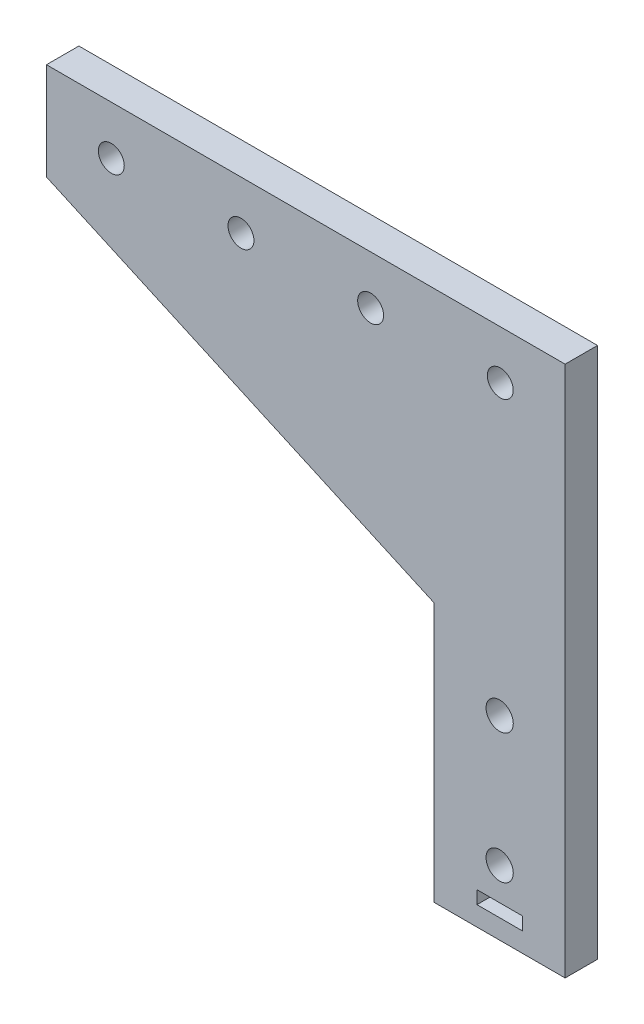
ISO-10303-21;
HEADER;
FILE_DESCRIPTION(('STEP AP214'),'2;1');
FILE_NAME('part.step','',(''),(''),'','','');
FILE_SCHEMA(('AUTOMOTIVE_DESIGN { 1 0 10303 214 1 1 1 1 }'));
ENDSEC;
DATA;
#1=APPLICATION_CONTEXT('core data for automotive mechanical design processes');
#2=APPLICATION_PROTOCOL_DEFINITION('international standard','automotive_design',2000,#1);
#3=PRODUCT_CONTEXT('',#1,'mechanical');
#4=PRODUCT('Part','Part','',(#3));
#5=PRODUCT_RELATED_PRODUCT_CATEGORY('part','',(#4));
#6=PRODUCT_DEFINITION_FORMATION('','',#4);
#7=PRODUCT_DEFINITION_CONTEXT('part definition',#1,'design');
#8=PRODUCT_DEFINITION('design','',#6,#7);
#9=PRODUCT_DEFINITION_SHAPE('','',#8);
#10=(LENGTH_UNIT() NAMED_UNIT(*) SI_UNIT(.MILLI.,.METRE.));
#11=(NAMED_UNIT(*) PLANE_ANGLE_UNIT() SI_UNIT($,.RADIAN.));
#12=(NAMED_UNIT(*) SI_UNIT($,.STERADIAN.) SOLID_ANGLE_UNIT());
#13=UNCERTAINTY_MEASURE_WITH_UNIT(LENGTH_MEASURE(1.E-05),#10,'distance_accuracy_value','');
#14=(GEOMETRIC_REPRESENTATION_CONTEXT(3) GLOBAL_UNCERTAINTY_ASSIGNED_CONTEXT((#13)) GLOBAL_UNIT_ASSIGNED_CONTEXT((#10,
#11,#12)) REPRESENTATION_CONTEXT('',''));
#15=CARTESIAN_POINT('',(0.,0.,0.));
#16=DIRECTION('',(0.,0.,1.));
#17=DIRECTION('',(1.,0.,0.));
#18=AXIS2_PLACEMENT_3D('',#15,#16,#17);
#19=CARTESIAN_POINT('',(0.,0.,5.));
#20=DIRECTION('',(0.,0.,-1.));
#21=DIRECTION('',(-1.,0.,0.));
#22=AXIS2_PLACEMENT_3D('',#19,#20,#21);
#23=PLANE('',#22);
#24=CARTESIAN_POINT('',(-70.,74.5,5.));
#25=DIRECTION('',(0.,0.,1.));
#26=DIRECTION('',(1.,0.,0.));
#27=AXIS2_PLACEMENT_3D('',#24,#25,#26);
#28=CIRCLE('',#27,2.);
#29=CARTESIAN_POINT('',(-68.,74.5,5.));
#30=VERTEX_POINT('',#29);
#31=EDGE_CURVE('E168',#30,#30,#28,.T.);
#32=ORIENTED_EDGE('',*,*,#31,.F.);
#33=EDGE_LOOP('',(#32));
#34=FACE_BOUND('',#33,.T.);
#35=CARTESIAN_POINT('',(-10.0957912661567,30.,5.));
#36=DIRECTION('',(0.,0.,1.));
#37=DIRECTION('',(1.,0.,0.));
#38=AXIS2_PLACEMENT_3D('',#35,#36,#37);
#39=CIRCLE('',#38,2.1);
#40=CARTESIAN_POINT('',(-7.99579126615672,30.,5.));
#41=VERTEX_POINT('',#40);
#42=EDGE_CURVE('E176',#41,#41,#39,.T.);
#43=ORIENTED_EDGE('',*,*,#42,.F.);
#44=EDGE_LOOP('',(#43));
#45=FACE_BOUND('',#44,.T.);
#46=CARTESIAN_POINT('',(-10.0957912661567,10.,5.));
#47=DIRECTION('',(0.,0.,1.));
#48=DIRECTION('',(1.,0.,0.));
#49=AXIS2_PLACEMENT_3D('',#46,#47,#48);
#50=CIRCLE('',#49,2.1);
#51=CARTESIAN_POINT('',(-7.99579126615672,10.,5.));
#52=VERTEX_POINT('',#51);
#53=EDGE_CURVE('E184',#52,#52,#50,.T.);
#54=ORIENTED_EDGE('',*,*,#53,.F.);
#55=EDGE_LOOP('',(#54));
#56=FACE_BOUND('',#55,.T.);
#57=DIRECTION('',(1.,0.,0.));
#58=VECTOR('',#57,1.);
#59=CARTESIAN_POINT('',(0.,0.,5.));
#60=LINE('',#59,#58);
#61=CARTESIAN_POINT('',(-20.1915825323134,0.,5.));
#62=VERTEX_POINT('',#61);
#63=CARTESIAN_POINT('',(0.,0.,5.));
#64=VERTEX_POINT('',#63);
#65=EDGE_CURVE('E192',#62,#64,#60,.T.);
#66=ORIENTED_EDGE('',*,*,#65,.T.);
#67=DIRECTION('',(0.,1.,0.));
#68=VECTOR('',#67,1.);
#69=CARTESIAN_POINT('',(0.,0.,5.));
#70=LINE('',#69,#68);
#71=CARTESIAN_POINT('',(0.,82.,5.));
#72=VERTEX_POINT('',#71);
#73=EDGE_CURVE('E196',#64,#72,#70,.T.);
#74=ORIENTED_EDGE('',*,*,#73,.T.);
#75=DIRECTION('',(-1.,0.,0.));
#76=VECTOR('',#75,1.);
#77=CARTESIAN_POINT('',(-80.,82.,5.));
#78=LINE('',#77,#76);
#79=CARTESIAN_POINT('',(-80.,82.,5.));
#80=VERTEX_POINT('',#79);
#81=EDGE_CURVE('E200',#72,#80,#78,.T.);
#82=ORIENTED_EDGE('',*,*,#81,.T.);
#83=DIRECTION('',(0.,-1.,0.));
#84=VECTOR('',#83,1.);
#85=CARTESIAN_POINT('',(-80.,82.,5.));
#86=LINE('',#85,#84);
#87=CARTESIAN_POINT('',(-80.,67.,5.));
#88=VERTEX_POINT('',#87);
#89=EDGE_CURVE('E203',#80,#88,#86,.T.);
#90=ORIENTED_EDGE('',*,*,#89,.T.);
#91=DIRECTION('',(0.911429200195557,-0.411456939461333,0.));
#92=VECTOR('',#91,1.);
#93=CARTESIAN_POINT('',(-80.,67.,5.));
#94=LINE('',#93,#92);
#95=CARTESIAN_POINT('',(-20.1915825323134,40.,5.));
#96=VERTEX_POINT('',#95);
#97=EDGE_CURVE('E206',#88,#96,#94,.T.);
#98=ORIENTED_EDGE('',*,*,#97,.T.);
#99=DIRECTION('',(0.,-1.,0.));
#100=VECTOR('',#99,1.);
#101=CARTESIAN_POINT('',(-20.1915825323134,0.,5.));
#102=LINE('',#101,#100);
#103=EDGE_CURVE('E209',#96,#62,#102,.T.);
#104=ORIENTED_EDGE('',*,*,#103,.T.);
#105=EDGE_LOOP('',(#66,#74,#82,#90,#98,#104));
#106=FACE_BOUND('',#105,.T.);
#107=DIRECTION('',(0.,-1.,0.));
#108=VECTOR('',#107,1.);
#109=CARTESIAN_POINT('',(-13.5957912661567,5.,5.));
#110=LINE('',#109,#108);
#111=CARTESIAN_POINT('',(-13.5957912661567,5.,5.));
#112=VERTEX_POINT('',#111);
#113=CARTESIAN_POINT('',(-13.5957912661567,3.,5.));
#114=VERTEX_POINT('',#113);
#115=EDGE_CURVE('E117',#112,#114,#110,.T.);
#116=ORIENTED_EDGE('',*,*,#115,.F.);
#117=DIRECTION('',(-1.,0.,0.));
#118=VECTOR('',#117,1.);
#119=CARTESIAN_POINT('',(-13.5957912661567,5.,5.));
#120=LINE('',#119,#118);
#121=CARTESIAN_POINT('',(-6.59579126615672,5.,5.));
#122=VERTEX_POINT('',#121);
#123=EDGE_CURVE('E144',#122,#112,#120,.T.);
#124=ORIENTED_EDGE('',*,*,#123,.F.);
#125=DIRECTION('',(0.,1.,0.));
#126=VECTOR('',#125,1.);
#127=CARTESIAN_POINT('',(-6.59579126615672,5.,5.));
#128=LINE('',#127,#126);
#129=CARTESIAN_POINT('',(-6.59579126615672,3.,5.));
#130=VERTEX_POINT('',#129);
#131=EDGE_CURVE('E140',#130,#122,#128,.T.);
#132=ORIENTED_EDGE('',*,*,#131,.F.);
#133=DIRECTION('',(1.,0.,0.));
#134=VECTOR('',#133,1.);
#135=CARTESIAN_POINT('',(-13.5957912661567,3.,5.));
#136=LINE('',#135,#134);
#137=EDGE_CURVE('E126',#114,#130,#136,.T.);
#138=ORIENTED_EDGE('',*,*,#137,.F.);
#139=EDGE_LOOP('',(#116,#124,#132,#138));
#140=FACE_BOUND('',#139,.T.);
#141=CARTESIAN_POINT('',(-50.,74.5,5.));
#142=DIRECTION('',(0.,0.,1.));
#143=DIRECTION('',(1.,0.,0.));
#144=AXIS2_PLACEMENT_3D('',#141,#142,#143);
#145=CIRCLE('',#144,2.);
#146=CARTESIAN_POINT('',(-48.,74.5,5.));
#147=VERTEX_POINT('',#146);
#148=EDGE_CURVE('E152',#147,#147,#145,.T.);
#149=ORIENTED_EDGE('',*,*,#148,.F.);
#150=EDGE_LOOP('',(#149));
#151=FACE_BOUND('',#150,.T.);
#152=CARTESIAN_POINT('',(-30.,74.5,5.));
#153=DIRECTION('',(0.,0.,1.));
#154=DIRECTION('',(1.,0.,0.));
#155=AXIS2_PLACEMENT_3D('',#152,#153,#154);
#156=CIRCLE('',#155,2.);
#157=CARTESIAN_POINT('',(-28.,74.5,5.));
#158=VERTEX_POINT('',#157);
#159=EDGE_CURVE('E344',#158,#158,#156,.T.);
#160=ORIENTED_EDGE('',*,*,#159,.F.);
#161=EDGE_LOOP('',(#160));
#162=FACE_BOUND('',#161,.T.);
#163=CARTESIAN_POINT('',(-10.,74.5,5.));
#164=DIRECTION('',(0.,0.,1.));
#165=DIRECTION('',(1.,0.,0.));
#166=AXIS2_PLACEMENT_3D('',#163,#164,#165);
#167=CIRCLE('',#166,2.);
#168=CARTESIAN_POINT('',(-8.00000000000001,74.5,5.));
#169=VERTEX_POINT('',#168);
#170=EDGE_CURVE('E333',#169,#169,#167,.T.);
#171=ORIENTED_EDGE('',*,*,#170,.F.);
#172=EDGE_LOOP('',(#171));
#173=FACE_BOUND('',#172,.T.);
#174=ADVANCED_FACE('F39',(#34,#45,#56,#106,#140,#151,#162,#173),#23,.F.);
#175=CARTESIAN_POINT('',(0.,0.,0.));
#176=DIRECTION('',(0.,0.,-1.));
#177=DIRECTION('',(-1.,0.,0.));
#178=AXIS2_PLACEMENT_3D('',#175,#176,#177);
#179=PLANE('',#178);
#180=CARTESIAN_POINT('',(-30.,74.5,0.));
#181=DIRECTION('',(0.,0.,1.));
#182=DIRECTION('',(1.,0.,0.));
#183=AXIS2_PLACEMENT_3D('',#180,#181,#182);
#184=CIRCLE('',#183,2.);
#185=CARTESIAN_POINT('',(-28.,74.5,0.));
#186=VERTEX_POINT('',#185);
#187=EDGE_CURVE('E341',#186,#186,#184,.T.);
#188=ORIENTED_EDGE('',*,*,#187,.T.);
#189=EDGE_LOOP('',(#188));
#190=FACE_BOUND('',#189,.T.);
#191=DIRECTION('',(-1.,0.,0.));
#192=VECTOR('',#191,1.);
#193=CARTESIAN_POINT('',(-13.5957912661567,5.,0.));
#194=LINE('',#193,#192);
#195=CARTESIAN_POINT('',(-6.59579126615672,5.,0.));
#196=VERTEX_POINT('',#195);
#197=CARTESIAN_POINT('',(-13.5957912661567,5.,0.));
#198=VERTEX_POINT('',#197);
#199=EDGE_CURVE('E127',#196,#198,#194,.T.);
#200=ORIENTED_EDGE('',*,*,#199,.T.);
#201=DIRECTION('',(0.,-1.,0.));
#202=VECTOR('',#201,1.);
#203=CARTESIAN_POINT('',(-13.5957912661567,5.,0.));
#204=LINE('',#203,#202);
#205=CARTESIAN_POINT('',(-13.5957912661567,3.,0.));
#206=VERTEX_POINT('',#205);
#207=EDGE_CURVE('E63',#198,#206,#204,.T.);
#208=ORIENTED_EDGE('',*,*,#207,.T.);
#209=DIRECTION('',(1.,0.,0.));
#210=VECTOR('',#209,1.);
#211=CARTESIAN_POINT('',(-13.5957912661567,3.,0.));
#212=LINE('',#211,#210);
#213=CARTESIAN_POINT('',(-6.59579126615672,3.,0.));
#214=VERTEX_POINT('',#213);
#215=EDGE_CURVE('E133',#206,#214,#212,.T.);
#216=ORIENTED_EDGE('',*,*,#215,.T.);
#217=DIRECTION('',(0.,1.,0.));
#218=VECTOR('',#217,1.);
#219=CARTESIAN_POINT('',(-6.59579126615672,5.,0.));
#220=LINE('',#219,#218);
#221=EDGE_CURVE('E155',#214,#196,#220,.T.);
#222=ORIENTED_EDGE('',*,*,#221,.T.);
#223=EDGE_LOOP('',(#200,#208,#216,#222));
#224=FACE_BOUND('',#223,.T.);
#225=CARTESIAN_POINT('',(-70.,74.5,0.));
#226=DIRECTION('',(0.,0.,1.));
#227=DIRECTION('',(1.,0.,0.));
#228=AXIS2_PLACEMENT_3D('',#225,#226,#227);
#229=CIRCLE('',#228,2.);
#230=CARTESIAN_POINT('',(-68.,74.5,0.));
#231=VERTEX_POINT('',#230);
#232=EDGE_CURVE('E135',#231,#231,#229,.T.);
#233=ORIENTED_EDGE('',*,*,#232,.T.);
#234=EDGE_LOOP('',(#233));
#235=FACE_BOUND('',#234,.T.);
#236=CARTESIAN_POINT('',(-10.0957912661567,10.,0.));
#237=DIRECTION('',(0.,0.,1.));
#238=DIRECTION('',(1.,0.,0.));
#239=AXIS2_PLACEMENT_3D('',#236,#237,#238);
#240=CIRCLE('',#239,2.1);
#241=CARTESIAN_POINT('',(-7.99579126615672,10.,0.));
#242=VERTEX_POINT('',#241);
#243=EDGE_CURVE('E180',#242,#242,#240,.T.);
#244=ORIENTED_EDGE('',*,*,#243,.T.);
#245=EDGE_LOOP('',(#244));
#246=FACE_BOUND('',#245,.T.);
#247=DIRECTION('',(1.,0.,0.));
#248=VECTOR('',#247,1.);
#249=CARTESIAN_POINT('',(0.,0.,0.));
#250=LINE('',#249,#248);
#251=CARTESIAN_POINT('',(-20.1915825323134,0.,0.));
#252=VERTEX_POINT('',#251);
#253=CARTESIAN_POINT('',(0.,0.,0.));
#254=VERTEX_POINT('',#253);
#255=EDGE_CURVE('E188',#252,#254,#250,.T.);
#256=ORIENTED_EDGE('',*,*,#255,.F.);
#257=DIRECTION('',(0.,-1.,0.));
#258=VECTOR('',#257,1.);
#259=CARTESIAN_POINT('',(-20.1915825323134,0.,0.));
#260=LINE('',#259,#258);
#261=CARTESIAN_POINT('',(-20.1915825323134,40.,0.));
#262=VERTEX_POINT('',#261);
#263=EDGE_CURVE('E197',#262,#252,#260,.T.);
#264=ORIENTED_EDGE('',*,*,#263,.F.);
#265=DIRECTION('',(0.911429200195557,-0.411456939461333,0.));
#266=VECTOR('',#265,1.);
#267=CARTESIAN_POINT('',(-80.,67.,0.));
#268=LINE('',#267,#266);
#269=CARTESIAN_POINT('',(-80.,67.,0.));
#270=VERTEX_POINT('',#269);
#271=EDGE_CURVE('E225',#270,#262,#268,.T.);
#272=ORIENTED_EDGE('',*,*,#271,.F.);
#273=DIRECTION('',(0.,-1.,0.));
#274=VECTOR('',#273,1.);
#275=CARTESIAN_POINT('',(-80.,82.,0.));
#276=LINE('',#275,#274);
#277=CARTESIAN_POINT('',(-80.,82.,0.));
#278=VERTEX_POINT('',#277);
#279=EDGE_CURVE('E222',#278,#270,#276,.T.);
#280=ORIENTED_EDGE('',*,*,#279,.F.);
#281=DIRECTION('',(-1.,0.,0.));
#282=VECTOR('',#281,1.);
#283=CARTESIAN_POINT('',(-80.,82.,0.));
#284=LINE('',#283,#282);
#285=CARTESIAN_POINT('',(0.,82.,0.));
#286=VERTEX_POINT('',#285);
#287=EDGE_CURVE('E219',#286,#278,#284,.T.);
#288=ORIENTED_EDGE('',*,*,#287,.F.);
#289=DIRECTION('',(0.,1.,0.));
#290=VECTOR('',#289,1.);
#291=CARTESIAN_POINT('',(0.,0.,0.));
#292=LINE('',#291,#290);
#293=EDGE_CURVE('E216',#254,#286,#292,.T.);
#294=ORIENTED_EDGE('',*,*,#293,.F.);
#295=EDGE_LOOP('',(#256,#264,#272,#280,#288,#294));
#296=FACE_BOUND('',#295,.T.);
#297=CARTESIAN_POINT('',(-10.0957912661567,30.,0.));
#298=DIRECTION('',(0.,0.,1.));
#299=DIRECTION('',(1.,0.,0.));
#300=AXIS2_PLACEMENT_3D('',#297,#298,#299);
#301=CIRCLE('',#300,2.1);
#302=CARTESIAN_POINT('',(-7.99579126615672,30.,0.));
#303=VERTEX_POINT('',#302);
#304=EDGE_CURVE('E172',#303,#303,#301,.T.);
#305=ORIENTED_EDGE('',*,*,#304,.T.);
#306=EDGE_LOOP('',(#305));
#307=FACE_BOUND('',#306,.T.);
#308=CARTESIAN_POINT('',(-50.,74.5,0.));
#309=DIRECTION('',(0.,0.,1.));
#310=DIRECTION('',(1.,0.,0.));
#311=AXIS2_PLACEMENT_3D('',#308,#309,#310);
#312=CIRCLE('',#311,2.);
#313=CARTESIAN_POINT('',(-48.,74.5,0.));
#314=VERTEX_POINT('',#313);
#315=EDGE_CURVE('E348',#314,#314,#312,.T.);
#316=ORIENTED_EDGE('',*,*,#315,.T.);
#317=EDGE_LOOP('',(#316));
#318=FACE_BOUND('',#317,.T.);
#319=CARTESIAN_POINT('',(-10.,74.5,0.));
#320=DIRECTION('',(0.,0.,1.));
#321=DIRECTION('',(1.,0.,0.));
#322=AXIS2_PLACEMENT_3D('',#319,#320,#321);
#323=CIRCLE('',#322,2.);
#324=CARTESIAN_POINT('',(-8.00000000000001,74.5,0.));
#325=VERTEX_POINT('',#324);
#326=EDGE_CURVE('E336',#325,#325,#323,.T.);
#327=ORIENTED_EDGE('',*,*,#326,.T.);
#328=EDGE_LOOP('',(#327));
#329=FACE_BOUND('',#328,.T.);
#330=ADVANCED_FACE('F256',(#190,#224,#235,#246,#296,#307,#318,#329),#179,.T.);
#331=CARTESIAN_POINT('',(0.,0.,5.));
#332=DIRECTION('',(0.,1.,0.));
#333=DIRECTION('',(0.,0.,1.));
#334=AXIS2_PLACEMENT_3D('',#331,#332,#333);
#335=PLANE('',#334);
#336=ORIENTED_EDGE('',*,*,#255,.T.);
#337=DIRECTION('',(0.,0.,-1.));
#338=VECTOR('',#337,1.);
#339=CARTESIAN_POINT('',(0.,0.,5.));
#340=LINE('',#339,#338);
#341=EDGE_CURVE('E11',#64,#254,#340,.T.);
#342=ORIENTED_EDGE('',*,*,#341,.F.);
#343=ORIENTED_EDGE('',*,*,#65,.F.);
#344=DIRECTION('',(0.,0.,-1.));
#345=VECTOR('',#344,1.);
#346=CARTESIAN_POINT('',(-20.1915825323134,0.,5.));
#347=LINE('',#346,#345);
#348=EDGE_CURVE('E212',#62,#252,#347,.T.);
#349=ORIENTED_EDGE('',*,*,#348,.T.);
#350=EDGE_LOOP('',(#336,#342,#343,#349));
#351=FACE_BOUND('',#350,.T.);
#352=ADVANCED_FACE('F41',(#351),#335,.F.);
#353=CARTESIAN_POINT('',(0.,0.,5.));
#354=DIRECTION('',(-1.,0.,0.));
#355=DIRECTION('',(0.,0.,1.));
#356=AXIS2_PLACEMENT_3D('',#353,#354,#355);
#357=PLANE('',#356);
#358=ORIENTED_EDGE('',*,*,#293,.T.);
#359=DIRECTION('',(0.,0.,-1.));
#360=VECTOR('',#359,1.);
#361=CARTESIAN_POINT('',(0.,82.,5.));
#362=LINE('',#361,#360);
#363=EDGE_CURVE('E48',#72,#286,#362,.T.);
#364=ORIENTED_EDGE('',*,*,#363,.F.);
#365=ORIENTED_EDGE('',*,*,#73,.F.);
#366=ORIENTED_EDGE('',*,*,#341,.T.);
#367=EDGE_LOOP('',(#358,#364,#365,#366));
#368=FACE_BOUND('',#367,.T.);
#369=ADVANCED_FACE('F273',(#368),#357,.F.);
#370=CARTESIAN_POINT('',(-80.,82.,5.));
#371=DIRECTION('',(0.,-1.,0.));
#372=DIRECTION('',(0.,0.,-1.));
#373=AXIS2_PLACEMENT_3D('',#370,#371,#372);
#374=PLANE('',#373);
#375=ORIENTED_EDGE('',*,*,#287,.T.);
#376=DIRECTION('',(0.,0.,-1.));
#377=VECTOR('',#376,1.);
#378=CARTESIAN_POINT('',(-80.,82.,5.));
#379=LINE('',#378,#377);
#380=EDGE_CURVE('E241',#80,#278,#379,.T.);
#381=ORIENTED_EDGE('',*,*,#380,.F.);
#382=ORIENTED_EDGE('',*,*,#81,.F.);
#383=ORIENTED_EDGE('',*,*,#363,.T.);
#384=EDGE_LOOP('',(#375,#381,#382,#383));
#385=FACE_BOUND('',#384,.T.);
#386=ADVANCED_FACE('F250',(#385),#374,.F.);
#387=CARTESIAN_POINT('',(-80.,82.,5.));
#388=DIRECTION('',(1.,0.,0.));
#389=DIRECTION('',(0.,0.,-1.));
#390=AXIS2_PLACEMENT_3D('',#387,#388,#389);
#391=PLANE('',#390);
#392=ORIENTED_EDGE('',*,*,#279,.T.);
#393=DIRECTION('',(0.,0.,-1.));
#394=VECTOR('',#393,1.);
#395=CARTESIAN_POINT('',(-80.,67.,5.));
#396=LINE('',#395,#394);
#397=EDGE_CURVE('E237',#88,#270,#396,.T.);
#398=ORIENTED_EDGE('',*,*,#397,.F.);
#399=ORIENTED_EDGE('',*,*,#89,.F.);
#400=ORIENTED_EDGE('',*,*,#380,.T.);
#401=EDGE_LOOP('',(#392,#398,#399,#400));
#402=FACE_BOUND('',#401,.T.);
#403=ADVANCED_FACE('F262',(#402),#391,.F.);
#404=CARTESIAN_POINT('',(-80.,67.,5.));
#405=DIRECTION('',(0.411456939461333,0.911429200195557,0.));
#406=DIRECTION('',(-0.911429200195557,0.411456939461333,0.));
#407=AXIS2_PLACEMENT_3D('',#404,#405,#406);
#408=PLANE('',#407);
#409=ORIENTED_EDGE('',*,*,#271,.T.);
#410=DIRECTION('',(0.,0.,-1.));
#411=VECTOR('',#410,1.);
#412=CARTESIAN_POINT('',(-20.1915825323134,40.,5.));
#413=LINE('',#412,#411);
#414=EDGE_CURVE('E233',#96,#262,#413,.T.);
#415=ORIENTED_EDGE('',*,*,#414,.F.);
#416=ORIENTED_EDGE('',*,*,#97,.F.);
#417=ORIENTED_EDGE('',*,*,#397,.T.);
#418=EDGE_LOOP('',(#409,#415,#416,#417));
#419=FACE_BOUND('',#418,.T.);
#420=ADVANCED_FACE('F266',(#419),#408,.F.);
#421=CARTESIAN_POINT('',(-20.1915825323134,0.,5.));
#422=DIRECTION('',(1.,0.,0.));
#423=DIRECTION('',(0.,0.,-1.));
#424=AXIS2_PLACEMENT_3D('',#421,#422,#423);
#425=PLANE('',#424);
#426=ORIENTED_EDGE('',*,*,#263,.T.);
#427=ORIENTED_EDGE('',*,*,#348,.F.);
#428=ORIENTED_EDGE('',*,*,#103,.F.);
#429=ORIENTED_EDGE('',*,*,#414,.T.);
#430=EDGE_LOOP('',(#426,#427,#428,#429));
#431=FACE_BOUND('',#430,.T.);
#432=ADVANCED_FACE('F276',(#431),#425,.F.);
#433=CARTESIAN_POINT('',(-10.0957912661567,10.,5.));
#434=DIRECTION('',(0.,0.,-1.));
#435=DIRECTION('',(-1.,0.,0.));
#436=AXIS2_PLACEMENT_3D('',#433,#434,#435);
#437=CYLINDRICAL_SURFACE('',#436,2.1);
#438=ORIENTED_EDGE('',*,*,#53,.T.);
#439=EDGE_LOOP('',(#438));
#440=FACE_BOUND('',#439,.T.);
#441=ORIENTED_EDGE('',*,*,#243,.F.);
#442=EDGE_LOOP('',(#441));
#443=FACE_BOUND('',#442,.T.);
#444=ADVANCED_FACE('F278',(#440,#443),#437,.F.);
#445=CARTESIAN_POINT('',(-10.0957912661567,30.,5.));
#446=DIRECTION('',(0.,0.,-1.));
#447=DIRECTION('',(-1.,0.,0.));
#448=AXIS2_PLACEMENT_3D('',#445,#446,#447);
#449=CYLINDRICAL_SURFACE('',#448,2.1);
#450=ORIENTED_EDGE('',*,*,#42,.T.);
#451=EDGE_LOOP('',(#450));
#452=FACE_BOUND('',#451,.T.);
#453=ORIENTED_EDGE('',*,*,#304,.F.);
#454=EDGE_LOOP('',(#453));
#455=FACE_BOUND('',#454,.T.);
#456=ADVANCED_FACE('F284',(#452,#455),#449,.F.);
#457=CARTESIAN_POINT('',(-70.,74.5,5.));
#458=DIRECTION('',(0.,0.,-1.));
#459=DIRECTION('',(-1.,0.,0.));
#460=AXIS2_PLACEMENT_3D('',#457,#458,#459);
#461=CYLINDRICAL_SURFACE('',#460,2.);
#462=ORIENTED_EDGE('',*,*,#31,.T.);
#463=EDGE_LOOP('',(#462));
#464=FACE_BOUND('',#463,.T.);
#465=ORIENTED_EDGE('',*,*,#232,.F.);
#466=EDGE_LOOP('',(#465));
#467=FACE_BOUND('',#466,.T.);
#468=ADVANCED_FACE('F301',(#464,#467),#461,.F.);
#469=CARTESIAN_POINT('',(-13.5957912661567,5.,5.));
#470=DIRECTION('',(1.,0.,0.));
#471=DIRECTION('',(0.,0.,-1.));
#472=AXIS2_PLACEMENT_3D('',#469,#470,#471);
#473=PLANE('',#472);
#474=ORIENTED_EDGE('',*,*,#207,.F.);
#475=DIRECTION('',(0.,0.,-1.));
#476=VECTOR('',#475,1.);
#477=CARTESIAN_POINT('',(-13.5957912661567,5.,5.));
#478=LINE('',#477,#476);
#479=EDGE_CURVE('E121',#112,#198,#478,.T.);
#480=ORIENTED_EDGE('',*,*,#479,.F.);
#481=ORIENTED_EDGE('',*,*,#115,.T.);
#482=DIRECTION('',(0.,0.,-1.));
#483=VECTOR('',#482,1.);
#484=CARTESIAN_POINT('',(-13.5957912661567,3.,5.));
#485=LINE('',#484,#483);
#486=EDGE_CURVE('E120',#114,#206,#485,.T.);
#487=ORIENTED_EDGE('',*,*,#486,.T.);
#488=EDGE_LOOP('',(#474,#480,#481,#487));
#489=FACE_BOUND('',#488,.T.);
#490=ADVANCED_FACE('F119',(#489),#473,.T.);
#491=CARTESIAN_POINT('',(-13.5957912661567,3.,5.));
#492=DIRECTION('',(0.,1.,0.));
#493=DIRECTION('',(-1.,0.,0.));
#494=AXIS2_PLACEMENT_3D('',#491,#492,#493);
#495=PLANE('',#494);
#496=ORIENTED_EDGE('',*,*,#215,.F.);
#497=ORIENTED_EDGE('',*,*,#486,.F.);
#498=ORIENTED_EDGE('',*,*,#137,.T.);
#499=DIRECTION('',(0.,0.,-1.));
#500=VECTOR('',#499,1.);
#501=CARTESIAN_POINT('',(-6.59579126615672,3.,5.));
#502=LINE('',#501,#500);
#503=EDGE_CURVE('E136',#130,#214,#502,.T.);
#504=ORIENTED_EDGE('',*,*,#503,.T.);
#505=EDGE_LOOP('',(#496,#497,#498,#504));
#506=FACE_BOUND('',#505,.T.);
#507=ADVANCED_FACE('F130',(#506),#495,.T.);
#508=CARTESIAN_POINT('',(-6.59579126615672,5.,5.));
#509=DIRECTION('',(-1.,0.,0.));
#510=DIRECTION('',(0.,-1.,0.));
#511=AXIS2_PLACEMENT_3D('',#508,#509,#510);
#512=PLANE('',#511);
#513=ORIENTED_EDGE('',*,*,#221,.F.);
#514=ORIENTED_EDGE('',*,*,#503,.F.);
#515=ORIENTED_EDGE('',*,*,#131,.T.);
#516=DIRECTION('',(0.,0.,-1.));
#517=VECTOR('',#516,1.);
#518=CARTESIAN_POINT('',(-6.59579126615672,5.,5.));
#519=LINE('',#518,#517);
#520=EDGE_CURVE('E55',#122,#196,#519,.T.);
#521=ORIENTED_EDGE('',*,*,#520,.T.);
#522=EDGE_LOOP('',(#513,#514,#515,#521));
#523=FACE_BOUND('',#522,.T.);
#524=ADVANCED_FACE('F310',(#523),#512,.T.);
#525=CARTESIAN_POINT('',(-13.5957912661567,5.,5.));
#526=DIRECTION('',(0.,-1.,0.));
#527=DIRECTION('',(1.,0.,0.));
#528=AXIS2_PLACEMENT_3D('',#525,#526,#527);
#529=PLANE('',#528);
#530=ORIENTED_EDGE('',*,*,#199,.F.);
#531=ORIENTED_EDGE('',*,*,#520,.F.);
#532=ORIENTED_EDGE('',*,*,#123,.T.);
#533=ORIENTED_EDGE('',*,*,#479,.T.);
#534=EDGE_LOOP('',(#530,#531,#532,#533));
#535=FACE_BOUND('',#534,.T.);
#536=ADVANCED_FACE('F313',(#535),#529,.T.);
#537=CARTESIAN_POINT('',(-50.,74.5,5.));
#538=DIRECTION('',(0.,0.,-1.));
#539=DIRECTION('',(-1.,0.,0.));
#540=AXIS2_PLACEMENT_3D('',#537,#538,#539);
#541=CYLINDRICAL_SURFACE('',#540,2.);
#542=ORIENTED_EDGE('',*,*,#148,.T.);
#543=EDGE_LOOP('',(#542));
#544=FACE_BOUND('',#543,.T.);
#545=ORIENTED_EDGE('',*,*,#315,.F.);
#546=EDGE_LOOP('',(#545));
#547=FACE_BOUND('',#546,.T.);
#548=ADVANCED_FACE('F317',(#544,#547),#541,.F.);
#549=CARTESIAN_POINT('',(-30.,74.5,5.));
#550=DIRECTION('',(0.,0.,-1.));
#551=DIRECTION('',(-1.,0.,0.));
#552=AXIS2_PLACEMENT_3D('',#549,#550,#551);
#553=CYLINDRICAL_SURFACE('',#552,2.);
#554=ORIENTED_EDGE('',*,*,#159,.T.);
#555=EDGE_LOOP('',(#554));
#556=FACE_BOUND('',#555,.T.);
#557=ORIENTED_EDGE('',*,*,#187,.F.);
#558=EDGE_LOOP('',(#557));
#559=FACE_BOUND('',#558,.T.);
#560=ADVANCED_FACE('F320',(#556,#559),#553,.F.);
#561=CARTESIAN_POINT('',(-10.,74.5,5.));
#562=DIRECTION('',(0.,0.,-1.));
#563=DIRECTION('',(-1.,0.,0.));
#564=AXIS2_PLACEMENT_3D('',#561,#562,#563);
#565=CYLINDRICAL_SURFACE('',#564,2.);
#566=ORIENTED_EDGE('',*,*,#170,.T.);
#567=EDGE_LOOP('',(#566));
#568=FACE_BOUND('',#567,.T.);
#569=ORIENTED_EDGE('',*,*,#326,.F.);
#570=EDGE_LOOP('',(#569));
#571=FACE_BOUND('',#570,.T.);
#572=ADVANCED_FACE('F324',(#568,#571),#565,.F.);
#573=CLOSED_SHELL('',(#174,#330,#352,#369,#386,#403,#420,#432,#444,#456,#468,#490,#507,#524,
#536,#548,#560,#572));
#574=MANIFOLD_SOLID_BREP('B2',#573);
#575=ADVANCED_BREP_SHAPE_REPRESENTATION('',(#18,#574),#14);
#576=SHAPE_DEFINITION_REPRESENTATION(#9,#575);
ENDSEC;
END-ISO-10303-21;
